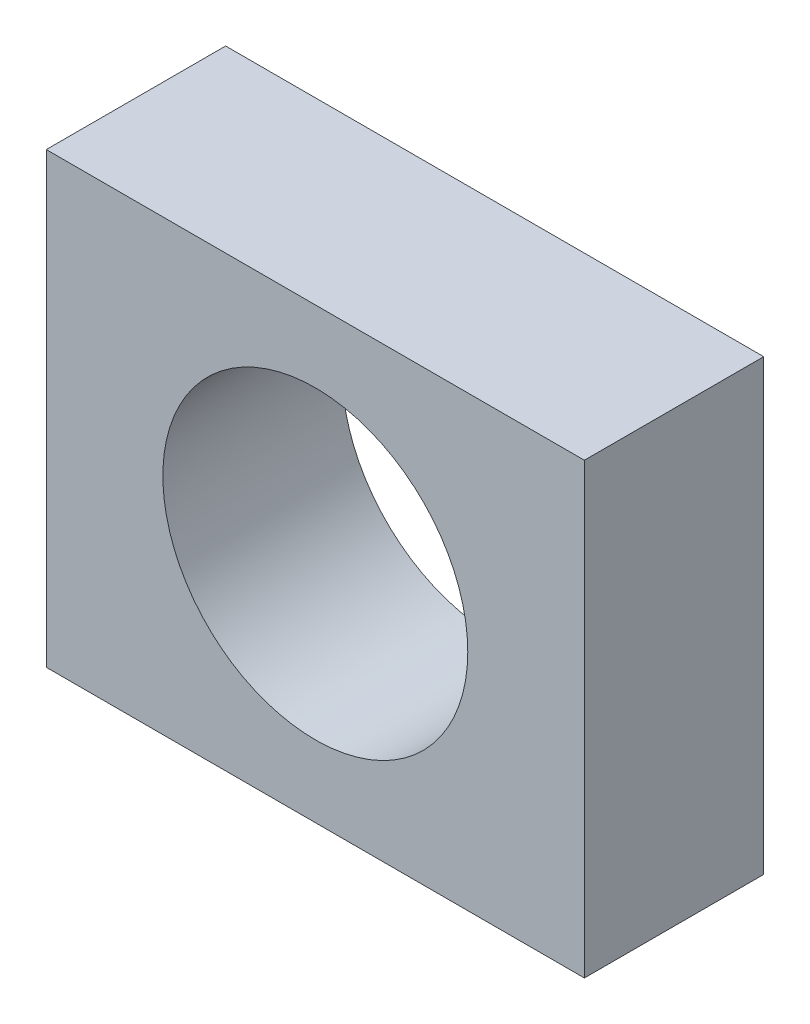
ISO-10303-21;
HEADER;
FILE_DESCRIPTION(('STEP AP214'),'2;1');
FILE_NAME('part.step','',(''),(''),'','','');
FILE_SCHEMA(('AUTOMOTIVE_DESIGN { 1 0 10303 214 1 1 1 1 }'));
ENDSEC;
DATA;
#1=APPLICATION_CONTEXT('core data for automotive mechanical design processes');
#2=APPLICATION_PROTOCOL_DEFINITION('international standard','automotive_design',2000,#1);
#3=PRODUCT_CONTEXT('',#1,'mechanical');
#4=PRODUCT('Part','Part','',(#3));
#5=PRODUCT_RELATED_PRODUCT_CATEGORY('part','',(#4));
#6=PRODUCT_DEFINITION_FORMATION('','',#4);
#7=PRODUCT_DEFINITION_CONTEXT('part definition',#1,'design');
#8=PRODUCT_DEFINITION('design','',#6,#7);
#9=PRODUCT_DEFINITION_SHAPE('','',#8);
#10=(LENGTH_UNIT() NAMED_UNIT(*) SI_UNIT(.MILLI.,.METRE.));
#11=(NAMED_UNIT(*) PLANE_ANGLE_UNIT() SI_UNIT($,.RADIAN.));
#12=(NAMED_UNIT(*) SI_UNIT($,.STERADIAN.) SOLID_ANGLE_UNIT());
#13=UNCERTAINTY_MEASURE_WITH_UNIT(LENGTH_MEASURE(1.E-05),#10,'distance_accuracy_value','');
#14=(GEOMETRIC_REPRESENTATION_CONTEXT(3) GLOBAL_UNCERTAINTY_ASSIGNED_CONTEXT((#13)) GLOBAL_UNIT_ASSIGNED_CONTEXT((#10,
#11,#12)) REPRESENTATION_CONTEXT('',''));
#15=CARTESIAN_POINT('',(0.,0.,0.));
#16=DIRECTION('',(0.,0.,1.));
#17=DIRECTION('',(1.,0.,0.));
#18=AXIS2_PLACEMENT_3D('',#15,#16,#17);
#19=CARTESIAN_POINT('',(0.,0.,1.));
#20=DIRECTION('',(0.,0.,-1.));
#21=DIRECTION('',(-1.,0.,0.));
#22=AXIS2_PLACEMENT_3D('',#19,#20,#21);
#23=PLANE('',#22);
#24=DIRECTION('',(0.,1.,0.));
#25=VECTOR('',#24,1.);
#26=CARTESIAN_POINT('',(1.5,-1.25,1.));
#27=LINE('',#26,#25);
#28=CARTESIAN_POINT('',(1.5,-1.25,1.));
#29=VERTEX_POINT('',#28);
#30=CARTESIAN_POINT('',(1.5,1.25,1.));
#31=VERTEX_POINT('',#30);
#32=EDGE_CURVE('E85',#29,#31,#27,.T.);
#33=ORIENTED_EDGE('',*,*,#32,.T.);
#34=DIRECTION('',(-1.,0.,0.));
#35=VECTOR('',#34,1.);
#36=CARTESIAN_POINT('',(-1.5,1.25,1.));
#37=LINE('',#36,#35);
#38=CARTESIAN_POINT('',(-1.5,1.25,1.));
#39=VERTEX_POINT('',#38);
#40=EDGE_CURVE('E80',#31,#39,#37,.T.);
#41=ORIENTED_EDGE('',*,*,#40,.T.);
#42=DIRECTION('',(0.,-1.,0.));
#43=VECTOR('',#42,1.);
#44=CARTESIAN_POINT('',(-1.5,-1.25,1.));
#45=LINE('',#44,#43);
#46=CARTESIAN_POINT('',(-1.5,-1.25,1.));
#47=VERTEX_POINT('',#46);
#48=EDGE_CURVE('E83',#39,#47,#45,.T.);
#49=ORIENTED_EDGE('',*,*,#48,.T.);
#50=DIRECTION('',(1.,0.,0.));
#51=VECTOR('',#50,1.);
#52=CARTESIAN_POINT('',(-1.5,-1.25,1.));
#53=LINE('',#52,#51);
#54=EDGE_CURVE('E50',#47,#29,#53,.T.);
#55=ORIENTED_EDGE('',*,*,#54,.T.);
#56=EDGE_LOOP('',(#33,#41,#49,#55));
#57=FACE_BOUND('',#56,.T.);
#58=CARTESIAN_POINT('',(0.,0.,1.));
#59=DIRECTION('',(0.,0.,1.));
#60=DIRECTION('',(1.,0.,0.));
#61=AXIS2_PLACEMENT_3D('',#58,#59,#60);
#62=CIRCLE('',#61,0.85);
#63=CARTESIAN_POINT('',(0.85,0.,1.));
#64=VERTEX_POINT('',#63);
#65=EDGE_CURVE('E100',#64,#64,#62,.T.);
#66=ORIENTED_EDGE('',*,*,#65,.F.);
#67=EDGE_LOOP('',(#66));
#68=FACE_BOUND('',#67,.T.);
#69=ADVANCED_FACE('F33',(#57,#68),#23,.F.);
#70=CARTESIAN_POINT('',(0.,0.,0.));
#71=DIRECTION('',(0.,0.,-1.));
#72=DIRECTION('',(-1.,0.,0.));
#73=AXIS2_PLACEMENT_3D('',#70,#71,#72);
#74=PLANE('',#73);
#75=DIRECTION('',(0.,1.,0.));
#76=VECTOR('',#75,1.);
#77=CARTESIAN_POINT('',(1.5,-1.25,0.));
#78=LINE('',#77,#76);
#79=CARTESIAN_POINT('',(1.5,-1.25,0.));
#80=VERTEX_POINT('',#79);
#81=CARTESIAN_POINT('',(1.5,1.25,0.));
#82=VERTEX_POINT('',#81);
#83=EDGE_CURVE('E97',#80,#82,#78,.T.);
#84=ORIENTED_EDGE('',*,*,#83,.F.);
#85=DIRECTION('',(1.,0.,0.));
#86=VECTOR('',#85,1.);
#87=CARTESIAN_POINT('',(-1.5,-1.25,0.));
#88=LINE('',#87,#86);
#89=CARTESIAN_POINT('',(-1.5,-1.25,0.));
#90=VERTEX_POINT('',#89);
#91=EDGE_CURVE('E73',#90,#80,#88,.T.);
#92=ORIENTED_EDGE('',*,*,#91,.F.);
#93=DIRECTION('',(0.,-1.,0.));
#94=VECTOR('',#93,1.);
#95=CARTESIAN_POINT('',(-1.5,-1.25,0.));
#96=LINE('',#95,#94);
#97=CARTESIAN_POINT('',(-1.5,1.25,0.));
#98=VERTEX_POINT('',#97);
#99=EDGE_CURVE('E67',#98,#90,#96,.T.);
#100=ORIENTED_EDGE('',*,*,#99,.F.);
#101=DIRECTION('',(-1.,0.,0.));
#102=VECTOR('',#101,1.);
#103=CARTESIAN_POINT('',(-1.5,1.25,0.));
#104=LINE('',#103,#102);
#105=EDGE_CURVE('E89',#82,#98,#104,.T.);
#106=ORIENTED_EDGE('',*,*,#105,.F.);
#107=EDGE_LOOP('',(#84,#92,#100,#106));
#108=FACE_BOUND('',#107,.T.);
#109=CARTESIAN_POINT('',(0.,0.,0.));
#110=DIRECTION('',(0.,0.,1.));
#111=DIRECTION('',(1.,0.,0.));
#112=AXIS2_PLACEMENT_3D('',#109,#110,#111);
#113=CIRCLE('',#112,0.85);
#114=CARTESIAN_POINT('',(0.85,0.,0.));
#115=VERTEX_POINT('',#114);
#116=EDGE_CURVE('E112',#115,#115,#113,.T.);
#117=ORIENTED_EDGE('',*,*,#116,.T.);
#118=EDGE_LOOP('',(#117));
#119=FACE_BOUND('',#118,.T.);
#120=ADVANCED_FACE('F108',(#108,#119),#74,.T.);
#121=CARTESIAN_POINT('',(1.5,-1.25,1.));
#122=DIRECTION('',(-1.,0.,0.));
#123=DIRECTION('',(0.,0.,1.));
#124=AXIS2_PLACEMENT_3D('',#121,#122,#123);
#125=PLANE('',#124);
#126=ORIENTED_EDGE('',*,*,#83,.T.);
#127=DIRECTION('',(0.,0.,-1.));
#128=VECTOR('',#127,1.);
#129=CARTESIAN_POINT('',(1.5,1.25,1.));
#130=LINE('',#129,#128);
#131=EDGE_CURVE('E11',#31,#82,#130,.T.);
#132=ORIENTED_EDGE('',*,*,#131,.F.);
#133=ORIENTED_EDGE('',*,*,#32,.F.);
#134=DIRECTION('',(0.,0.,-1.));
#135=VECTOR('',#134,1.);
#136=CARTESIAN_POINT('',(1.5,-1.25,1.));
#137=LINE('',#136,#135);
#138=EDGE_CURVE('E93',#29,#80,#137,.T.);
#139=ORIENTED_EDGE('',*,*,#138,.T.);
#140=EDGE_LOOP('',(#126,#132,#133,#139));
#141=FACE_BOUND('',#140,.T.);
#142=ADVANCED_FACE('F35',(#141),#125,.F.);
#143=CARTESIAN_POINT('',(-1.5,1.25,1.));
#144=DIRECTION('',(0.,-1.,0.));
#145=DIRECTION('',(0.,0.,-1.));
#146=AXIS2_PLACEMENT_3D('',#143,#144,#145);
#147=PLANE('',#146);
#148=ORIENTED_EDGE('',*,*,#105,.T.);
#149=DIRECTION('',(0.,0.,-1.));
#150=VECTOR('',#149,1.);
#151=CARTESIAN_POINT('',(-1.5,1.25,1.));
#152=LINE('',#151,#150);
#153=EDGE_CURVE('E42',#39,#98,#152,.T.);
#154=ORIENTED_EDGE('',*,*,#153,.F.);
#155=ORIENTED_EDGE('',*,*,#40,.F.);
#156=ORIENTED_EDGE('',*,*,#131,.T.);
#157=EDGE_LOOP('',(#148,#154,#155,#156));
#158=FACE_BOUND('',#157,.T.);
#159=ADVANCED_FACE('F88',(#158),#147,.F.);
#160=CARTESIAN_POINT('',(-1.5,-1.25,1.));
#161=DIRECTION('',(1.,0.,0.));
#162=DIRECTION('',(0.,0.,-1.));
#163=AXIS2_PLACEMENT_3D('',#160,#161,#162);
#164=PLANE('',#163);
#165=ORIENTED_EDGE('',*,*,#99,.T.);
#166=DIRECTION('',(0.,0.,-1.));
#167=VECTOR('',#166,1.);
#168=CARTESIAN_POINT('',(-1.5,-1.25,1.));
#169=LINE('',#168,#167);
#170=EDGE_CURVE('E90',#47,#90,#169,.T.);
#171=ORIENTED_EDGE('',*,*,#170,.F.);
#172=ORIENTED_EDGE('',*,*,#48,.F.);
#173=ORIENTED_EDGE('',*,*,#153,.T.);
#174=EDGE_LOOP('',(#165,#171,#172,#173));
#175=FACE_BOUND('',#174,.T.);
#176=ADVANCED_FACE('F91',(#175),#164,.F.);
#177=CARTESIAN_POINT('',(-1.5,-1.25,1.));
#178=DIRECTION('',(0.,1.,0.));
#179=DIRECTION('',(0.,0.,1.));
#180=AXIS2_PLACEMENT_3D('',#177,#178,#179);
#181=PLANE('',#180);
#182=ORIENTED_EDGE('',*,*,#91,.T.);
#183=ORIENTED_EDGE('',*,*,#138,.F.);
#184=ORIENTED_EDGE('',*,*,#54,.F.);
#185=ORIENTED_EDGE('',*,*,#170,.T.);
#186=EDGE_LOOP('',(#182,#183,#184,#185));
#187=FACE_BOUND('',#186,.T.);
#188=ADVANCED_FACE('F105',(#187),#181,.F.);
#189=CARTESIAN_POINT('',(0.,0.,1.));
#190=DIRECTION('',(0.,0.,-1.));
#191=DIRECTION('',(-1.,0.,0.));
#192=AXIS2_PLACEMENT_3D('',#189,#190,#191);
#193=CYLINDRICAL_SURFACE('',#192,0.85);
#194=ORIENTED_EDGE('',*,*,#65,.T.);
#195=EDGE_LOOP('',(#194));
#196=FACE_BOUND('',#195,.T.);
#197=ORIENTED_EDGE('',*,*,#116,.F.);
#198=EDGE_LOOP('',(#197));
#199=FACE_BOUND('',#198,.T.);
#200=ADVANCED_FACE('F118',(#196,#199),#193,.F.);
#201=CLOSED_SHELL('',(#69,#120,#142,#159,#176,#188,#200));
#202=MANIFOLD_SOLID_BREP('B2',#201);
#203=ADVANCED_BREP_SHAPE_REPRESENTATION('',(#18,#202),#14);
#204=SHAPE_DEFINITION_REPRESENTATION(#9,#203);
ENDSEC;
END-ISO-10303-21;
